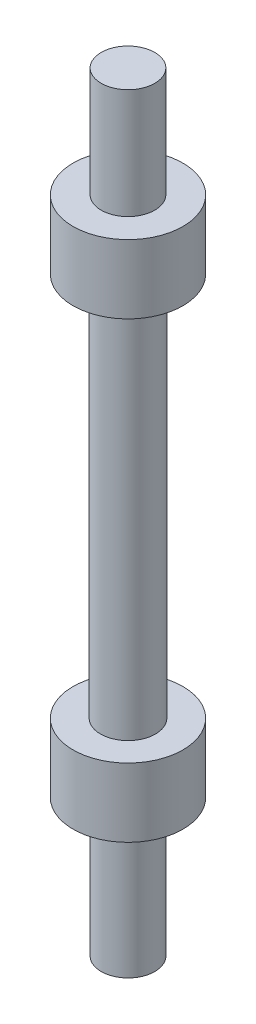
ISO-10303-21;
HEADER;
FILE_DESCRIPTION(('STEP AP214'),'2;1');
FILE_NAME('part.step','',(''),(''),'','','');
FILE_SCHEMA(('AUTOMOTIVE_DESIGN { 1 0 10303 214 1 1 1 1 }'));
ENDSEC;
DATA;
#1=APPLICATION_CONTEXT('core data for automotive mechanical design processes');
#2=APPLICATION_PROTOCOL_DEFINITION('international standard','automotive_design',2000,#1);
#3=PRODUCT_CONTEXT('',#1,'mechanical');
#4=PRODUCT('Part','Part','',(#3));
#5=PRODUCT_RELATED_PRODUCT_CATEGORY('part','',(#4));
#6=PRODUCT_DEFINITION_FORMATION('','',#4);
#7=PRODUCT_DEFINITION_CONTEXT('part definition',#1,'design');
#8=PRODUCT_DEFINITION('design','',#6,#7);
#9=PRODUCT_DEFINITION_SHAPE('','',#8);
#10=(LENGTH_UNIT() NAMED_UNIT(*) SI_UNIT(.MILLI.,.METRE.));
#11=(NAMED_UNIT(*) PLANE_ANGLE_UNIT() SI_UNIT($,.RADIAN.));
#12=(NAMED_UNIT(*) SI_UNIT($,.STERADIAN.) SOLID_ANGLE_UNIT());
#13=UNCERTAINTY_MEASURE_WITH_UNIT(LENGTH_MEASURE(1.E-05),#10,'distance_accuracy_value','');
#14=(GEOMETRIC_REPRESENTATION_CONTEXT(3) GLOBAL_UNCERTAINTY_ASSIGNED_CONTEXT((#13)) GLOBAL_UNIT_ASSIGNED_CONTEXT((#10,
#11,#12)) REPRESENTATION_CONTEXT('',''));
#15=CARTESIAN_POINT('',(0.,0.,0.));
#16=DIRECTION('',(0.,0.,1.));
#17=DIRECTION('',(1.,0.,0.));
#18=AXIS2_PLACEMENT_3D('',#15,#16,#17);
#19=CARTESIAN_POINT('',(0.,28.,0.));
#20=DIRECTION('',(0.,-1.,0.));
#21=DIRECTION('',(0.,0.,-1.));
#22=AXIS2_PLACEMENT_3D('',#19,#20,#21);
#23=CYLINDRICAL_SURFACE('',#22,2.);
#24=CARTESIAN_POINT('',(0.,28.,0.));
#25=DIRECTION('',(0.,1.,0.));
#26=DIRECTION('',(0.,0.,1.));
#27=AXIS2_PLACEMENT_3D('',#24,#25,#26);
#28=CIRCLE('',#27,2.);
#29=CARTESIAN_POINT('',(0.,28.,2.));
#30=VERTEX_POINT('',#29);
#31=EDGE_CURVE('E55',#30,#30,#28,.T.);
#32=ORIENTED_EDGE('',*,*,#31,.F.);
#33=EDGE_LOOP('',(#32));
#34=FACE_BOUND('',#33,.T.);
#35=CARTESIAN_POINT('',(0.,0.,0.));
#36=DIRECTION('',(0.,1.,0.));
#37=DIRECTION('',(0.,0.,1.));
#38=AXIS2_PLACEMENT_3D('',#35,#36,#37);
#39=CIRCLE('',#38,2.);
#40=CARTESIAN_POINT('',(0.,0.,2.));
#41=VERTEX_POINT('',#40);
#42=EDGE_CURVE('E44',#41,#41,#39,.T.);
#43=ORIENTED_EDGE('',*,*,#42,.T.);
#44=EDGE_LOOP('',(#43));
#45=FACE_BOUND('',#44,.T.);
#46=ADVANCED_FACE('F41',(#34,#45),#23,.T.);
#47=CARTESIAN_POINT('',(0.,-5.,0.));
#48=DIRECTION('',(0.,1.,0.));
#49=DIRECTION('',(0.,0.,1.));
#50=AXIS2_PLACEMENT_3D('',#47,#48,#49);
#51=CYLINDRICAL_SURFACE('',#50,4.);
#52=CARTESIAN_POINT('',(0.,-5.,0.));
#53=DIRECTION('',(0.,-1.,0.));
#54=DIRECTION('',(0.,0.,-1.));
#55=AXIS2_PLACEMENT_3D('',#52,#53,#54);
#56=CIRCLE('',#55,4.);
#57=CARTESIAN_POINT('',(0.,-5.,-4.));
#58=VERTEX_POINT('',#57);
#59=EDGE_CURVE('E73',#58,#58,#56,.T.);
#60=ORIENTED_EDGE('',*,*,#59,.F.);
#61=EDGE_LOOP('',(#60));
#62=FACE_BOUND('',#61,.T.);
#63=CARTESIAN_POINT('',(0.,0.,0.));
#64=DIRECTION('',(0.,-1.,0.));
#65=DIRECTION('',(0.,0.,-1.));
#66=AXIS2_PLACEMENT_3D('',#63,#64,#65);
#67=CIRCLE('',#66,4.);
#68=CARTESIAN_POINT('',(0.,0.,-4.));
#69=VERTEX_POINT('',#68);
#70=EDGE_CURVE('E71',#69,#69,#67,.T.);
#71=ORIENTED_EDGE('',*,*,#70,.T.);
#72=EDGE_LOOP('',(#71));
#73=FACE_BOUND('',#72,.T.);
#74=ADVANCED_FACE('F96',(#62,#73),#51,.T.);
#75=CARTESIAN_POINT('',(0.,-5.,0.));
#76=DIRECTION('',(0.,-1.,0.));
#77=DIRECTION('',(0.,0.,-1.));
#78=AXIS2_PLACEMENT_3D('',#75,#76,#77);
#79=PLANE('',#78);
#80=CARTESIAN_POINT('',(0.,-5.,0.));
#81=DIRECTION('',(0.,-1.,0.));
#82=DIRECTION('',(0.,0.,-1.));
#83=AXIS2_PLACEMENT_3D('',#80,#81,#82);
#84=CIRCLE('',#83,1.95);
#85=CARTESIAN_POINT('',(0.,-5.,-1.95));
#86=VERTEX_POINT('',#85);
#87=EDGE_CURVE('E49',#86,#86,#84,.T.);
#88=ORIENTED_EDGE('',*,*,#87,.F.);
#89=EDGE_LOOP('',(#88));
#90=FACE_BOUND('',#89,.T.);
#91=ORIENTED_EDGE('',*,*,#59,.T.);
#92=EDGE_LOOP('',(#91));
#93=FACE_BOUND('',#92,.T.);
#94=ADVANCED_FACE('F92',(#90,#93),#79,.T.);
#95=CARTESIAN_POINT('',(0.,0.,0.));
#96=DIRECTION('',(0.,-1.,0.));
#97=DIRECTION('',(0.,0.,-1.));
#98=AXIS2_PLACEMENT_3D('',#95,#96,#97);
#99=PLANE('',#98);
#100=ORIENTED_EDGE('',*,*,#42,.F.);
#101=EDGE_LOOP('',(#100));
#102=FACE_BOUND('',#101,.T.);
#103=ORIENTED_EDGE('',*,*,#70,.F.);
#104=EDGE_LOOP('',(#103));
#105=FACE_BOUND('',#104,.T.);
#106=ADVANCED_FACE('F88',(#102,#105),#99,.F.);
#107=CARTESIAN_POINT('',(0.,-15.,0.));
#108=DIRECTION('',(0.,1.,0.));
#109=DIRECTION('',(0.,0.,1.));
#110=AXIS2_PLACEMENT_3D('',#107,#108,#109);
#111=CYLINDRICAL_SURFACE('',#110,1.95);
#112=CARTESIAN_POINT('',(0.,-15.,0.));
#113=DIRECTION('',(0.,-1.,0.));
#114=DIRECTION('',(0.,0.,-1.));
#115=AXIS2_PLACEMENT_3D('',#112,#113,#114);
#116=CIRCLE('',#115,1.95);
#117=CARTESIAN_POINT('',(0.,-15.,-1.95));
#118=VERTEX_POINT('',#117);
#119=EDGE_CURVE('E64',#118,#118,#116,.T.);
#120=ORIENTED_EDGE('',*,*,#119,.F.);
#121=EDGE_LOOP('',(#120));
#122=FACE_BOUND('',#121,.T.);
#123=ORIENTED_EDGE('',*,*,#87,.T.);
#124=EDGE_LOOP('',(#123));
#125=FACE_BOUND('',#124,.T.);
#126=ADVANCED_FACE('F91',(#122,#125),#111,.T.);
#127=CARTESIAN_POINT('',(0.,-15.,0.));
#128=DIRECTION('',(0.,-1.,0.));
#129=DIRECTION('',(0.,0.,-1.));
#130=AXIS2_PLACEMENT_3D('',#127,#128,#129);
#131=PLANE('',#130);
#132=ORIENTED_EDGE('',*,*,#119,.T.);
#133=EDGE_LOOP('',(#132));
#134=FACE_BOUND('',#133,.T.);
#135=ADVANCED_FACE('F110',(#134),#131,.T.);
#136=CARTESIAN_POINT('',(0.,33.,0.));
#137=DIRECTION('',(0.,-1.,0.));
#138=DIRECTION('',(0.,0.,-1.));
#139=AXIS2_PLACEMENT_3D('',#136,#137,#138);
#140=CYLINDRICAL_SURFACE('',#139,4.);
#141=CARTESIAN_POINT('',(0.,33.,0.));
#142=DIRECTION('',(0.,1.,0.));
#143=DIRECTION('',(0.,0.,1.));
#144=AXIS2_PLACEMENT_3D('',#141,#142,#143);
#145=CIRCLE('',#144,4.);
#146=CARTESIAN_POINT('',(0.,33.,4.));
#147=VERTEX_POINT('',#146);
#148=EDGE_CURVE('E60',#147,#147,#145,.T.);
#149=ORIENTED_EDGE('',*,*,#148,.F.);
#150=EDGE_LOOP('',(#149));
#151=FACE_BOUND('',#150,.T.);
#152=CARTESIAN_POINT('',(0.,28.,0.));
#153=DIRECTION('',(0.,1.,0.));
#154=DIRECTION('',(0.,0.,1.));
#155=AXIS2_PLACEMENT_3D('',#152,#153,#154);
#156=CIRCLE('',#155,4.);
#157=CARTESIAN_POINT('',(0.,28.,4.));
#158=VERTEX_POINT('',#157);
#159=EDGE_CURVE('E65',#158,#158,#156,.T.);
#160=ORIENTED_EDGE('',*,*,#159,.T.);
#161=EDGE_LOOP('',(#160));
#162=FACE_BOUND('',#161,.T.);
#163=ADVANCED_FACE('F114',(#151,#162),#140,.T.);
#164=CARTESIAN_POINT('',(0.,33.,0.));
#165=DIRECTION('',(0.,1.,0.));
#166=DIRECTION('',(0.,0.,1.));
#167=AXIS2_PLACEMENT_3D('',#164,#165,#166);
#168=PLANE('',#167);
#169=CARTESIAN_POINT('',(0.,33.,0.));
#170=DIRECTION('',(0.,1.,0.));
#171=DIRECTION('',(0.,0.,1.));
#172=AXIS2_PLACEMENT_3D('',#169,#170,#171);
#173=CIRCLE('',#172,1.95);
#174=CARTESIAN_POINT('',(0.,33.,1.95));
#175=VERTEX_POINT('',#174);
#176=EDGE_CURVE('E10',#175,#175,#173,.T.);
#177=ORIENTED_EDGE('',*,*,#176,.F.);
#178=EDGE_LOOP('',(#177));
#179=FACE_BOUND('',#178,.T.);
#180=ORIENTED_EDGE('',*,*,#148,.T.);
#181=EDGE_LOOP('',(#180));
#182=FACE_BOUND('',#181,.T.);
#183=ADVANCED_FACE('F118',(#179,#182),#168,.T.);
#184=CARTESIAN_POINT('',(0.,28.,0.));
#185=DIRECTION('',(0.,1.,0.));
#186=DIRECTION('',(0.,0.,1.));
#187=AXIS2_PLACEMENT_3D('',#184,#185,#186);
#188=PLANE('',#187);
#189=ORIENTED_EDGE('',*,*,#31,.T.);
#190=EDGE_LOOP('',(#189));
#191=FACE_BOUND('',#190,.T.);
#192=ORIENTED_EDGE('',*,*,#159,.F.);
#193=EDGE_LOOP('',(#192));
#194=FACE_BOUND('',#193,.T.);
#195=ADVANCED_FACE('F120',(#191,#194),#188,.F.);
#196=CARTESIAN_POINT('',(0.,41.,0.));
#197=DIRECTION('',(0.,-1.,0.));
#198=DIRECTION('',(0.,0.,-1.));
#199=AXIS2_PLACEMENT_3D('',#196,#197,#198);
#200=CYLINDRICAL_SURFACE('',#199,1.95);
#201=CARTESIAN_POINT('',(0.,41.,0.));
#202=DIRECTION('',(0.,1.,0.));
#203=DIRECTION('',(0.,0.,1.));
#204=AXIS2_PLACEMENT_3D('',#201,#202,#203);
#205=CIRCLE('',#204,1.95);
#206=CARTESIAN_POINT('',(0.,41.,1.95));
#207=VERTEX_POINT('',#206);
#208=EDGE_CURVE('E59',#207,#207,#205,.T.);
#209=ORIENTED_EDGE('',*,*,#208,.F.);
#210=EDGE_LOOP('',(#209));
#211=FACE_BOUND('',#210,.T.);
#212=ORIENTED_EDGE('',*,*,#176,.T.);
#213=EDGE_LOOP('',(#212));
#214=FACE_BOUND('',#213,.T.);
#215=ADVANCED_FACE('F123',(#211,#214),#200,.T.);
#216=CARTESIAN_POINT('',(0.,41.,0.));
#217=DIRECTION('',(0.,1.,0.));
#218=DIRECTION('',(0.,0.,1.));
#219=AXIS2_PLACEMENT_3D('',#216,#217,#218);
#220=PLANE('',#219);
#221=ORIENTED_EDGE('',*,*,#208,.T.);
#222=EDGE_LOOP('',(#221));
#223=FACE_BOUND('',#222,.T.);
#224=ADVANCED_FACE('F129',(#223),#220,.T.);
#225=CLOSED_SHELL('',(#46,#74,#94,#106,#126,#135,#163,#183,#195,#215,#224));
#226=MANIFOLD_SOLID_BREP('B2',#225);
#227=ADVANCED_BREP_SHAPE_REPRESENTATION('',(#18,#226),#14);
#228=SHAPE_DEFINITION_REPRESENTATION(#9,#227);
ENDSEC;
END-ISO-10303-21;
